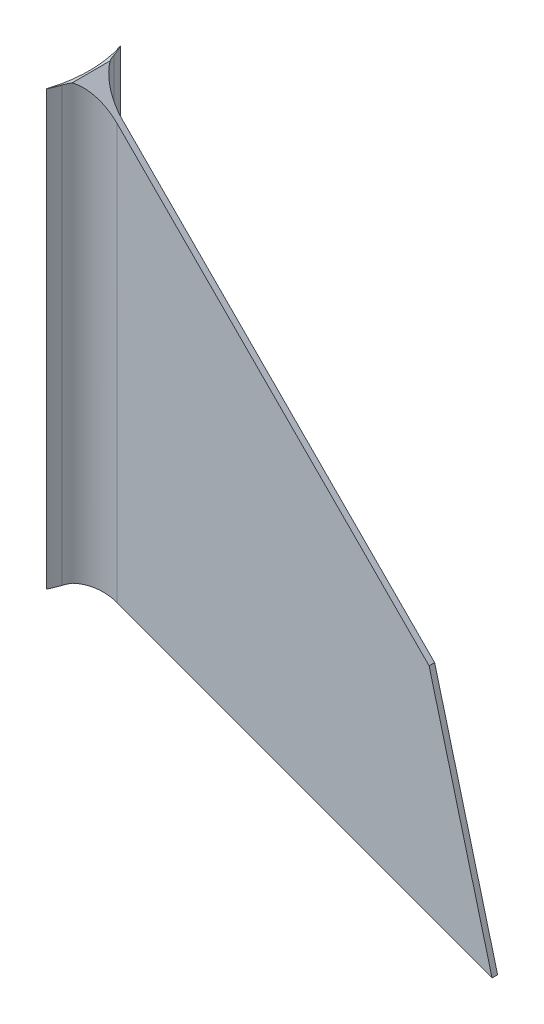
ISO-10303-21;
HEADER;
FILE_DESCRIPTION(('STEP AP214'),'2;1');
FILE_NAME('part.step','',(''),(''),'','','');
FILE_SCHEMA(('AUTOMOTIVE_DESIGN { 1 0 10303 214 1 1 1 1 }'));
ENDSEC;
DATA;
#1=APPLICATION_CONTEXT('core data for automotive mechanical design processes');
#2=APPLICATION_PROTOCOL_DEFINITION('international standard','automotive_design',2000,#1);
#3=PRODUCT_CONTEXT('',#1,'mechanical');
#4=PRODUCT('Part','Part','',(#3));
#5=PRODUCT_RELATED_PRODUCT_CATEGORY('part','',(#4));
#6=PRODUCT_DEFINITION_FORMATION('','',#4);
#7=PRODUCT_DEFINITION_CONTEXT('part definition',#1,'design');
#8=PRODUCT_DEFINITION('design','',#6,#7);
#9=PRODUCT_DEFINITION_SHAPE('','',#8);
#10=(LENGTH_UNIT() NAMED_UNIT(*) SI_UNIT(.MILLI.,.METRE.));
#11=(NAMED_UNIT(*) PLANE_ANGLE_UNIT() SI_UNIT($,.RADIAN.));
#12=(NAMED_UNIT(*) SI_UNIT($,.STERADIAN.) SOLID_ANGLE_UNIT());
#13=UNCERTAINTY_MEASURE_WITH_UNIT(LENGTH_MEASURE(1.E-05),#10,'distance_accuracy_value','');
#14=(GEOMETRIC_REPRESENTATION_CONTEXT(3) GLOBAL_UNCERTAINTY_ASSIGNED_CONTEXT((#13)) GLOBAL_UNIT_ASSIGNED_CONTEXT((#10,
#11,#12)) REPRESENTATION_CONTEXT('',''));
#15=CARTESIAN_POINT('',(0.,0.,0.));
#16=DIRECTION('',(0.,0.,1.));
#17=DIRECTION('',(1.,0.,0.));
#18=AXIS2_PLACEMENT_3D('',#15,#16,#17);
#19=CARTESIAN_POINT('',(0.,0.,-1.5));
#20=DIRECTION('',(-0.344507703036126,-0.938783490773444,0.));
#21=DIRECTION('',(0.938783490773444,-0.344507703036126,0.));
#22=AXIS2_PLACEMENT_3D('',#19,#20,#21);
#23=PLANE('',#22);
#24=DIRECTION('',(0.,0.,1.));
#25=VECTOR('',#24,1.);
#26=CARTESIAN_POINT('',(218.,-80.,-1.5));
#27=LINE('',#26,#25);
#28=CARTESIAN_POINT('',(218.,-80.,-1.5));
#29=VERTEX_POINT('',#28);
#30=CARTESIAN_POINT('',(218.,-80.,1.5));
#31=VERTEX_POINT('',#30);
#32=EDGE_CURVE('E159',#29,#31,#27,.T.);
#33=ORIENTED_EDGE('',*,*,#32,.T.);
#34=DIRECTION('',(0.938783490773444,-0.344507703036126,0.));
#35=VECTOR('',#34,1.);
#36=CARTESIAN_POINT('',(0.,0.,1.5));
#37=LINE('',#36,#35);
#38=CARTESIAN_POINT('',(15.4564627432608,-5.67209641954524,1.5));
#39=VERTEX_POINT('',#38);
#40=EDGE_CURVE('E139',#39,#31,#37,.T.);
#41=ORIENTED_EDGE('',*,*,#40,.F.);
#42=CARTESIAN_POINT('',(15.4564627432608,-5.67209641954525,19.5));
#43=DIRECTION('',(-0.344507703036126,-0.938783490773444,0.));
#44=DIRECTION('',(0.938783490773444,-0.344507703036126,0.));
#45=AXIS2_PLACEMENT_3D('',#42,#43,#44);
#46=ELLIPSE('',#45,19.1737500466377,18.);
#47=CARTESIAN_POINT('',(0.,0.,10.275155314793));
#48=VERTEX_POINT('',#47);
#49=EDGE_CURVE('E175',#39,#48,#46,.F.);
#50=ORIENTED_EDGE('',*,*,#49,.T.);
#51=DIRECTION('',(0.,0.,1.));
#52=VECTOR('',#51,1.);
#53=CARTESIAN_POINT('',(0.,0.,-1.5));
#54=LINE('',#53,#52);
#55=CARTESIAN_POINT('',(0.,0.,-10.275155314793));
#56=VERTEX_POINT('',#55);
#57=EDGE_CURVE('E60',#56,#48,#54,.T.);
#58=ORIENTED_EDGE('',*,*,#57,.F.);
#59=CARTESIAN_POINT('',(15.4564627432608,-5.67209641954525,-19.5));
#60=DIRECTION('',(-0.344507703036126,-0.938783490773444,0.));
#61=DIRECTION('',(0.938783490773444,-0.344507703036126,0.));
#62=AXIS2_PLACEMENT_3D('',#59,#60,#61);
#63=ELLIPSE('',#62,19.1737500466377,18.);
#64=CARTESIAN_POINT('',(15.4564627432608,-5.67209641954524,-1.5));
#65=VERTEX_POINT('',#64);
#66=EDGE_CURVE('E189',#56,#65,#63,.F.);
#67=ORIENTED_EDGE('',*,*,#66,.T.);
#68=DIRECTION('',(0.938783490773444,-0.344507703036126,0.));
#69=VECTOR('',#68,1.);
#70=CARTESIAN_POINT('',(0.,0.,-1.5));
#71=LINE('',#70,#69);
#72=EDGE_CURVE('E151',#65,#29,#71,.T.);
#73=ORIENTED_EDGE('',*,*,#72,.T.);
#74=EDGE_LOOP('',(#33,#41,#50,#58,#67,#73));
#75=FACE_BOUND('',#74,.T.);
#76=ADVANCED_FACE('F38',(#75),#23,.T.);
#77=CARTESIAN_POINT('',(-8.02704190106866E-13,234.,-1.5));
#78=DIRECTION('',(0.70902045612049,0.705187913114436,0.));
#79=DIRECTION('',(-0.705187913114436,0.70902045612049,0.));
#80=AXIS2_PLACEMENT_3D('',#77,#78,#79);
#81=PLANE('',#80);
#82=DIRECTION('',(0.,0.,1.));
#83=VECTOR('',#82,1.);
#84=CARTESIAN_POINT('',(-8.02704190106866E-13,234.,-1.5));
#85=LINE('',#84,#83);
#86=CARTESIAN_POINT('',(-8.02704190106866E-13,234.,-10.2751553147944));
#87=VERTEX_POINT('',#86);
#88=CARTESIAN_POINT('',(-8.02704190106866E-13,234.,10.2751553147944));
#89=VERTEX_POINT('',#88);
#90=EDGE_CURVE('E52',#87,#89,#85,.T.);
#91=ORIENTED_EDGE('',*,*,#90,.T.);
#92=CARTESIAN_POINT('',(15.4564627432608,218.459534741829,19.5));
#93=DIRECTION('',(0.70902045612049,0.705187913114436,0.));
#94=DIRECTION('',(0.705187913114436,-0.70902045612049,0.));
#95=AXIS2_PLACEMENT_3D('',#92,#93,#94);
#96=ELLIPSE('',#95,25.525111343023,18.);
#97=CARTESIAN_POINT('',(15.4564627432608,218.459534741829,1.5));
#98=VERTEX_POINT('',#97);
#99=EDGE_CURVE('E181',#89,#98,#96,.F.);
#100=ORIENTED_EDGE('',*,*,#99,.T.);
#101=DIRECTION('',(-0.705187913114436,0.70902045612049,0.));
#102=VECTOR('',#101,1.);
#103=CARTESIAN_POINT('',(-8.02704190106866E-13,234.,1.5));
#104=LINE('',#103,#102);
#105=CARTESIAN_POINT('',(184.,49.,1.5));
#106=VERTEX_POINT('',#105);
#107=EDGE_CURVE('E148',#106,#98,#104,.T.);
#108=ORIENTED_EDGE('',*,*,#107,.F.);
#109=DIRECTION('',(0.,0.,1.));
#110=VECTOR('',#109,1.);
#111=CARTESIAN_POINT('',(184.,49.,-1.5));
#112=LINE('',#111,#110);
#113=CARTESIAN_POINT('',(184.,49.,-1.5));
#114=VERTEX_POINT('',#113);
#115=EDGE_CURVE('E162',#114,#106,#112,.T.);
#116=ORIENTED_EDGE('',*,*,#115,.F.);
#117=DIRECTION('',(-0.705187913114436,0.70902045612049,0.));
#118=VECTOR('',#117,1.);
#119=CARTESIAN_POINT('',(-8.02704190106866E-13,234.,-1.5));
#120=LINE('',#119,#118);
#121=CARTESIAN_POINT('',(15.4564627432608,218.459534741829,-1.5));
#122=VERTEX_POINT('',#121);
#123=EDGE_CURVE('E156',#114,#122,#120,.T.);
#124=ORIENTED_EDGE('',*,*,#123,.T.);
#125=CARTESIAN_POINT('',(15.4564627432608,218.459534741829,-19.5));
#126=DIRECTION('',(0.70902045612049,0.705187913114436,0.));
#127=DIRECTION('',(0.705187913114436,-0.70902045612049,0.));
#128=AXIS2_PLACEMENT_3D('',#125,#126,#127);
#129=ELLIPSE('',#128,25.525111343023,18.);
#130=EDGE_CURVE('E46',#122,#87,#129,.F.);
#131=ORIENTED_EDGE('',*,*,#130,.T.);
#132=EDGE_LOOP('',(#91,#100,#108,#116,#124,#131));
#133=FACE_BOUND('',#132,.T.);
#134=ADVANCED_FACE('F192',(#133),#81,.T.);
#135=CARTESIAN_POINT('',(184.,49.,-1.5));
#136=DIRECTION('',(0.966977369095331,0.254862252319701,0.));
#137=DIRECTION('',(-0.254862252319701,0.966977369095332,0.));
#138=AXIS2_PLACEMENT_3D('',#135,#136,#137);
#139=PLANE('',#138);
#140=ORIENTED_EDGE('',*,*,#115,.T.);
#141=DIRECTION('',(-0.254862252319701,0.966977369095332,0.));
#142=VECTOR('',#141,1.);
#143=CARTESIAN_POINT('',(184.,49.,1.5));
#144=LINE('',#143,#142);
#145=EDGE_CURVE('E141',#31,#106,#144,.T.);
#146=ORIENTED_EDGE('',*,*,#145,.F.);
#147=ORIENTED_EDGE('',*,*,#32,.F.);
#148=DIRECTION('',(-0.254862252319701,0.966977369095332,0.));
#149=VECTOR('',#148,1.);
#150=CARTESIAN_POINT('',(184.,49.,-1.5));
#151=LINE('',#150,#149);
#152=EDGE_CURVE('E153',#29,#114,#151,.T.);
#153=ORIENTED_EDGE('',*,*,#152,.T.);
#154=EDGE_LOOP('',(#140,#146,#147,#153));
#155=FACE_BOUND('',#154,.T.);
#156=ADVANCED_FACE('F216',(#155),#139,.T.);
#157=CARTESIAN_POINT('',(0.,0.,-1.5));
#158=DIRECTION('',(0.,0.,1.));
#159=DIRECTION('',(1.,0.,0.));
#160=AXIS2_PLACEMENT_3D('',#157,#158,#159);
#161=PLANE('',#160);
#162=ORIENTED_EDGE('',*,*,#72,.F.);
#163=DIRECTION('',(0.,-1.,0.));
#164=VECTOR('',#163,1.);
#165=CARTESIAN_POINT('',(15.4564627432608,0.,-1.5));
#166=LINE('',#165,#164);
#167=EDGE_CURVE('E185',#65,#122,#166,.F.);
#168=ORIENTED_EDGE('',*,*,#167,.T.);
#169=ORIENTED_EDGE('',*,*,#123,.F.);
#170=ORIENTED_EDGE('',*,*,#152,.F.);
#171=EDGE_LOOP('',(#162,#168,#169,#170));
#172=FACE_BOUND('',#171,.T.);
#173=ADVANCED_FACE('F220',(#172),#161,.F.);
#174=CARTESIAN_POINT('',(0.,0.,1.5));
#175=DIRECTION('',(0.,0.,1.));
#176=DIRECTION('',(1.,0.,0.));
#177=AXIS2_PLACEMENT_3D('',#174,#175,#176);
#178=PLANE('',#177);
#179=ORIENTED_EDGE('',*,*,#107,.T.);
#180=DIRECTION('',(0.,1.,0.));
#181=VECTOR('',#180,1.);
#182=CARTESIAN_POINT('',(15.4564627432608,0.,1.5));
#183=LINE('',#182,#181);
#184=EDGE_CURVE('E170',#98,#39,#183,.F.);
#185=ORIENTED_EDGE('',*,*,#184,.T.);
#186=ORIENTED_EDGE('',*,*,#40,.T.);
#187=ORIENTED_EDGE('',*,*,#145,.T.);
#188=EDGE_LOOP('',(#179,#185,#186,#187));
#189=FACE_BOUND('',#188,.T.);
#190=ADVANCED_FACE('F211',(#189),#178,.T.);
#191=CARTESIAN_POINT('',(-66.,234.,0.));
#192=DIRECTION('',(0.,-1.,0.));
#193=DIRECTION('',(0.,0.,-1.));
#194=AXIS2_PLACEMENT_3D('',#191,#192,#193);
#195=CYLINDRICAL_SURFACE('',#194,65.);
#196=CARTESIAN_POINT('',(-66.,0.,0.));
#197=DIRECTION('',(0.,1.,0.));
#198=DIRECTION('',(0.,0.,1.));
#199=AXIS2_PLACEMENT_3D('',#196,#197,#198);
#200=CIRCLE('',#199,65.);
#201=CARTESIAN_POINT('',(-4.15341561573509,0.,20.));
#202=VERTEX_POINT('',#201);
#203=CARTESIAN_POINT('',(-4.1534156157351,0.,-20.));
#204=VERTEX_POINT('',#203);
#205=EDGE_CURVE('E135',#202,#204,#200,.T.);
#206=ORIENTED_EDGE('',*,*,#205,.F.);
#207=DIRECTION('',(0.,-1.,0.));
#208=VECTOR('',#207,1.);
#209=CARTESIAN_POINT('',(-4.15341561573509,234.,20.));
#210=LINE('',#209,#208);
#211=CARTESIAN_POINT('',(-4.15341561573509,234.,20.));
#212=VERTEX_POINT('',#211);
#213=EDGE_CURVE('E134',#212,#202,#210,.T.);
#214=ORIENTED_EDGE('',*,*,#213,.F.);
#215=CARTESIAN_POINT('',(-66.,234.,0.));
#216=DIRECTION('',(0.,1.,0.));
#217=DIRECTION('',(0.,0.,1.));
#218=AXIS2_PLACEMENT_3D('',#215,#216,#217);
#219=CIRCLE('',#218,65.);
#220=CARTESIAN_POINT('',(-4.1534156157351,234.,-20.));
#221=VERTEX_POINT('',#220);
#222=EDGE_CURVE('E117',#212,#221,#219,.T.);
#223=ORIENTED_EDGE('',*,*,#222,.T.);
#224=DIRECTION('',(0.,-1.,0.));
#225=VECTOR('',#224,1.);
#226=CARTESIAN_POINT('',(-4.1534156157351,234.,-20.));
#227=LINE('',#226,#225);
#228=EDGE_CURVE('E131',#221,#204,#227,.T.);
#229=ORIENTED_EDGE('',*,*,#228,.T.);
#230=EDGE_LOOP('',(#206,#214,#223,#229));
#231=FACE_BOUND('',#230,.T.);
#232=ADVANCED_FACE('F130',(#231),#195,.F.);
#233=CARTESIAN_POINT('',(-66.,234.,0.));
#234=DIRECTION('',(0.,1.,0.));
#235=DIRECTION('',(0.,0.,1.));
#236=AXIS2_PLACEMENT_3D('',#233,#234,#235);
#237=PLANE('',#236);
#238=ORIENTED_EDGE('',*,*,#222,.F.);
#239=CARTESIAN_POINT('',(-37.,234.,2.9676221775301));
#240=DIRECTION('',(0.,1.,0.));
#241=DIRECTION('',(0.,0.,1.));
#242=AXIS2_PLACEMENT_3D('',#239,#240,#241);
#243=CIRCLE('',#242,37.);
#244=CARTESIAN_POINT('',(-1.71110688180639,234.,14.0894036217371));
#245=VERTEX_POINT('',#244);
#246=EDGE_CURVE('E168',#212,#245,#243,.T.);
#247=ORIENTED_EDGE('',*,*,#246,.T.);
#248=CARTESIAN_POINT('',(15.4564627432608,234.,19.5));
#249=DIRECTION('',(0.,1.,0.));
#250=DIRECTION('',(0.,0.,1.));
#251=AXIS2_PLACEMENT_3D('',#248,#249,#250);
#252=CIRCLE('',#251,18.);
#253=EDGE_CURVE('E179',#245,#89,#252,.F.);
#254=ORIENTED_EDGE('',*,*,#253,.T.);
#255=ORIENTED_EDGE('',*,*,#90,.F.);
#256=CARTESIAN_POINT('',(15.4564627432608,234.,-19.5));
#257=DIRECTION('',(0.,1.,0.));
#258=DIRECTION('',(0.,0.,1.));
#259=AXIS2_PLACEMENT_3D('',#256,#257,#258);
#260=CIRCLE('',#259,18.);
#261=CARTESIAN_POINT('',(-1.71110688180639,234.,-14.0894036217371));
#262=VERTEX_POINT('',#261);
#263=EDGE_CURVE('E11',#87,#262,#260,.F.);
#264=ORIENTED_EDGE('',*,*,#263,.T.);
#265=CARTESIAN_POINT('',(-37.,234.,-2.9676221775301));
#266=DIRECTION('',(0.,1.,0.));
#267=DIRECTION('',(0.,0.,1.));
#268=AXIS2_PLACEMENT_3D('',#265,#266,#267);
#269=CIRCLE('',#268,37.);
#270=EDGE_CURVE('E113',#262,#221,#269,.T.);
#271=ORIENTED_EDGE('',*,*,#270,.T.);
#272=EDGE_LOOP('',(#238,#247,#254,#255,#264,#271));
#273=FACE_BOUND('',#272,.T.);
#274=ADVANCED_FACE('F115',(#273),#237,.T.);
#275=CARTESIAN_POINT('',(-66.,0.,0.));
#276=DIRECTION('',(0.,1.,0.));
#277=DIRECTION('',(0.,0.,1.));
#278=AXIS2_PLACEMENT_3D('',#275,#276,#277);
#279=PLANE('',#278);
#280=ORIENTED_EDGE('',*,*,#57,.T.);
#281=CARTESIAN_POINT('',(15.4564627432608,0.,19.5));
#282=DIRECTION('',(0.,1.,0.));
#283=DIRECTION('',(0.,0.,1.));
#284=AXIS2_PLACEMENT_3D('',#281,#282,#283);
#285=CIRCLE('',#284,18.);
#286=CARTESIAN_POINT('',(-1.71110688180639,0.,14.0894036217371));
#287=VERTEX_POINT('',#286);
#288=EDGE_CURVE('E177',#48,#287,#285,.T.);
#289=ORIENTED_EDGE('',*,*,#288,.T.);
#290=CARTESIAN_POINT('',(-37.,0.,2.9676221775301));
#291=DIRECTION('',(0.,1.,0.));
#292=DIRECTION('',(0.,0.,1.));
#293=AXIS2_PLACEMENT_3D('',#290,#291,#292);
#294=CIRCLE('',#293,37.);
#295=EDGE_CURVE('E124',#287,#202,#294,.F.);
#296=ORIENTED_EDGE('',*,*,#295,.T.);
#297=ORIENTED_EDGE('',*,*,#205,.T.);
#298=CARTESIAN_POINT('',(-37.,0.,-2.9676221775301));
#299=DIRECTION('',(0.,1.,0.));
#300=DIRECTION('',(0.,0.,1.));
#301=AXIS2_PLACEMENT_3D('',#298,#299,#300);
#302=CIRCLE('',#301,37.);
#303=CARTESIAN_POINT('',(-1.71110688180639,0.,-14.0894036217371));
#304=VERTEX_POINT('',#303);
#305=EDGE_CURVE('E125',#204,#304,#302,.F.);
#306=ORIENTED_EDGE('',*,*,#305,.T.);
#307=CARTESIAN_POINT('',(15.4564627432608,0.,-19.5));
#308=DIRECTION('',(0.,1.,0.));
#309=DIRECTION('',(0.,0.,1.));
#310=AXIS2_PLACEMENT_3D('',#307,#308,#309);
#311=CIRCLE('',#310,18.);
#312=EDGE_CURVE('E187',#304,#56,#311,.T.);
#313=ORIENTED_EDGE('',*,*,#312,.T.);
#314=EDGE_LOOP('',(#280,#289,#296,#297,#306,#313));
#315=FACE_BOUND('',#314,.T.);
#316=ADVANCED_FACE('F198',(#315),#279,.F.);
#317=CARTESIAN_POINT('',(-37.,234.,-2.9676221775301));
#318=DIRECTION('',(0.,-1.,0.));
#319=DIRECTION('',(0.,0.,-1.));
#320=AXIS2_PLACEMENT_3D('',#317,#318,#319);
#321=CYLINDRICAL_SURFACE('',#320,37.);
#322=ORIENTED_EDGE('',*,*,#270,.F.);
#323=DIRECTION('',(0.,-1.,0.));
#324=VECTOR('',#323,1.);
#325=CARTESIAN_POINT('',(-1.71110688180639,234.,-14.0894036217371));
#326=LINE('',#325,#324);
#327=EDGE_CURVE('E183',#262,#304,#326,.T.);
#328=ORIENTED_EDGE('',*,*,#327,.T.);
#329=ORIENTED_EDGE('',*,*,#305,.F.);
#330=ORIENTED_EDGE('',*,*,#228,.F.);
#331=EDGE_LOOP('',(#322,#328,#329,#330));
#332=FACE_BOUND('',#331,.T.);
#333=ADVANCED_FACE('F137',(#332),#321,.T.);
#334=CARTESIAN_POINT('',(-37.,234.,2.9676221775301));
#335=DIRECTION('',(0.,-1.,0.));
#336=DIRECTION('',(0.,0.,-1.));
#337=AXIS2_PLACEMENT_3D('',#334,#335,#336);
#338=CYLINDRICAL_SURFACE('',#337,37.);
#339=ORIENTED_EDGE('',*,*,#295,.F.);
#340=DIRECTION('',(0.,-1.,0.));
#341=VECTOR('',#340,1.);
#342=CARTESIAN_POINT('',(-1.71110688180639,234.,14.0894036217371));
#343=LINE('',#342,#341);
#344=EDGE_CURVE('E173',#287,#245,#343,.F.);
#345=ORIENTED_EDGE('',*,*,#344,.T.);
#346=ORIENTED_EDGE('',*,*,#246,.F.);
#347=ORIENTED_EDGE('',*,*,#213,.T.);
#348=EDGE_LOOP('',(#339,#345,#346,#347));
#349=FACE_BOUND('',#348,.T.);
#350=ADVANCED_FACE('F201',(#349),#338,.T.);
#351=CARTESIAN_POINT('',(15.4564627432608,234.,19.5));
#352=DIRECTION('',(0.,-1.,0.));
#353=DIRECTION('',(0.,0.,-1.));
#354=AXIS2_PLACEMENT_3D('',#351,#352,#353);
#355=CYLINDRICAL_SURFACE('',#354,18.);
#356=ORIENTED_EDGE('',*,*,#253,.F.);
#357=ORIENTED_EDGE('',*,*,#344,.F.);
#358=ORIENTED_EDGE('',*,*,#288,.F.);
#359=ORIENTED_EDGE('',*,*,#49,.F.);
#360=ORIENTED_EDGE('',*,*,#184,.F.);
#361=ORIENTED_EDGE('',*,*,#99,.F.);
#362=EDGE_LOOP('',(#356,#357,#358,#359,#360,#361));
#363=FACE_BOUND('',#362,.T.);
#364=ADVANCED_FACE('F206',(#363),#355,.F.);
#365=CARTESIAN_POINT('',(15.4564627432608,234.,-19.5));
#366=DIRECTION('',(0.,-1.,0.));
#367=DIRECTION('',(0.,0.,-1.));
#368=AXIS2_PLACEMENT_3D('',#365,#366,#367);
#369=CYLINDRICAL_SURFACE('',#368,18.);
#370=ORIENTED_EDGE('',*,*,#130,.F.);
#371=ORIENTED_EDGE('',*,*,#167,.F.);
#372=ORIENTED_EDGE('',*,*,#66,.F.);
#373=ORIENTED_EDGE('',*,*,#312,.F.);
#374=ORIENTED_EDGE('',*,*,#327,.F.);
#375=ORIENTED_EDGE('',*,*,#263,.F.);
#376=EDGE_LOOP('',(#370,#371,#372,#373,#374,#375));
#377=FACE_BOUND('',#376,.T.);
#378=ADVANCED_FACE('F40',(#377),#369,.F.);
#379=CLOSED_SHELL('',(#76,#134,#156,#173,#190,#232,#274,#316,#333,#350,#364,#378));
#380=MANIFOLD_SOLID_BREP('B2',#379);
#381=ADVANCED_BREP_SHAPE_REPRESENTATION('',(#18,#380),#14);
#382=SHAPE_DEFINITION_REPRESENTATION(#9,#381);
ENDSEC;
END-ISO-10303-21;
